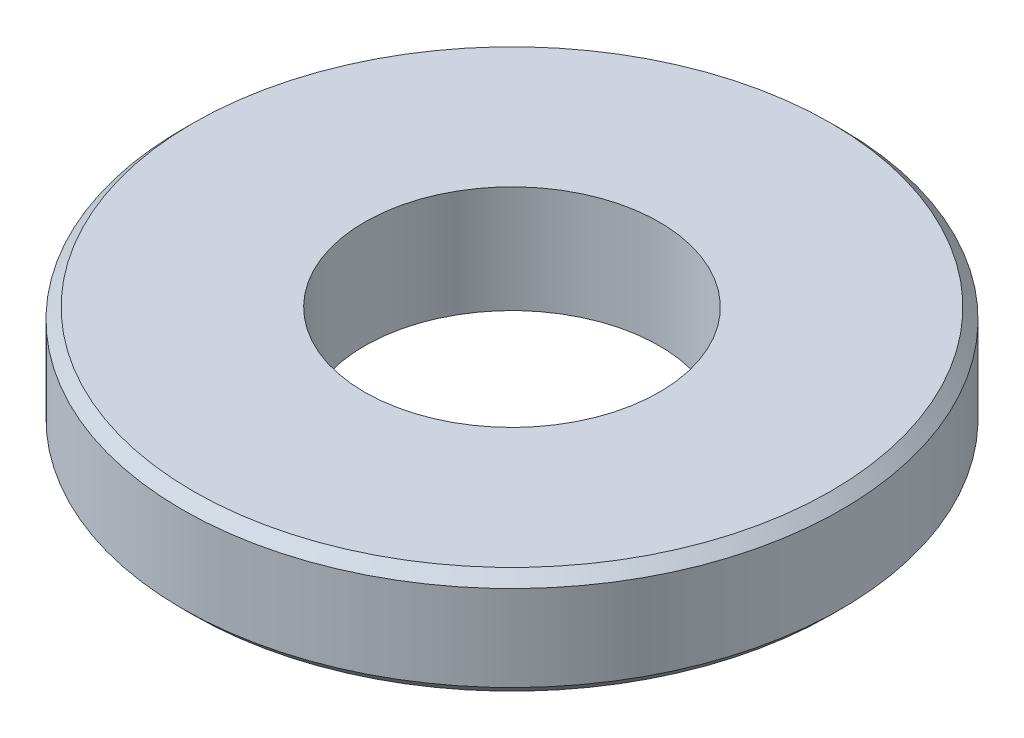
ISO-10303-21;
HEADER;
FILE_DESCRIPTION(('STEP AP214'),'2;1');
FILE_NAME('part.step','',(''),(''),'','','');
FILE_SCHEMA(('AUTOMOTIVE_DESIGN { 1 0 10303 214 1 1 1 1 }'));
ENDSEC;
DATA;
#1=APPLICATION_CONTEXT('core data for automotive mechanical design processes');
#2=APPLICATION_PROTOCOL_DEFINITION('international standard','automotive_design',2000,#1);
#3=PRODUCT_CONTEXT('',#1,'mechanical');
#4=PRODUCT('Part','Part','',(#3));
#5=PRODUCT_RELATED_PRODUCT_CATEGORY('part','',(#4));
#6=PRODUCT_DEFINITION_FORMATION('','',#4);
#7=PRODUCT_DEFINITION_CONTEXT('part definition',#1,'design');
#8=PRODUCT_DEFINITION('design','',#6,#7);
#9=PRODUCT_DEFINITION_SHAPE('','',#8);
#10=(LENGTH_UNIT() NAMED_UNIT(*) SI_UNIT(.MILLI.,.METRE.));
#11=(NAMED_UNIT(*) PLANE_ANGLE_UNIT() SI_UNIT($,.RADIAN.));
#12=(NAMED_UNIT(*) SI_UNIT($,.STERADIAN.) SOLID_ANGLE_UNIT());
#13=UNCERTAINTY_MEASURE_WITH_UNIT(LENGTH_MEASURE(1.E-05),#10,'distance_accuracy_value','');
#14=(GEOMETRIC_REPRESENTATION_CONTEXT(3) GLOBAL_UNCERTAINTY_ASSIGNED_CONTEXT((#13)) GLOBAL_UNIT_ASSIGNED_CONTEXT((#10,
#11,#12)) REPRESENTATION_CONTEXT('',''));
#15=CARTESIAN_POINT('',(0.,0.,0.));
#16=DIRECTION('',(0.,0.,1.));
#17=DIRECTION('',(1.,0.,0.));
#18=AXIS2_PLACEMENT_3D('',#15,#16,#17);
#19=CARTESIAN_POINT('',(0.,4.,0.));
#20=DIRECTION('',(0.,1.,0.));
#21=DIRECTION('',(0.,0.,1.));
#22=AXIS2_PLACEMENT_3D('',#19,#20,#21);
#23=PLANE('',#22);
#24=CARTESIAN_POINT('',(0.,4.,0.));
#25=DIRECTION('',(0.,1.,0.));
#26=DIRECTION('',(0.,0.,1.));
#27=AXIS2_PLACEMENT_3D('',#24,#25,#26);
#28=CIRCLE('',#27,11.9);
#29=CARTESIAN_POINT('',(0.,4.,11.9));
#30=VERTEX_POINT('',#29);
#31=EDGE_CURVE('E10',#30,#30,#28,.T.);
#32=ORIENTED_EDGE('',*,*,#31,.T.);
#33=EDGE_LOOP('',(#32));
#34=FACE_BOUND('',#33,.T.);
#35=CARTESIAN_POINT('',(0.,4.,0.));
#36=DIRECTION('',(0.,1.,0.));
#37=DIRECTION('',(0.,0.,1.));
#38=AXIS2_PLACEMENT_3D('',#35,#36,#37);
#39=CIRCLE('',#38,5.5);
#40=CARTESIAN_POINT('',(0.,4.,5.5));
#41=VERTEX_POINT('',#40);
#42=EDGE_CURVE('E51',#41,#41,#39,.T.);
#43=ORIENTED_EDGE('',*,*,#42,.F.);
#44=EDGE_LOOP('',(#43));
#45=FACE_BOUND('',#44,.T.);
#46=ADVANCED_FACE('F31',(#34,#45),#23,.T.);
#47=CARTESIAN_POINT('',(0.,0.,0.));
#48=DIRECTION('',(0.,1.,0.));
#49=DIRECTION('',(0.,0.,1.));
#50=AXIS2_PLACEMENT_3D('',#47,#48,#49);
#51=PLANE('',#50);
#52=CARTESIAN_POINT('',(0.,0.,0.));
#53=DIRECTION('',(0.,1.,0.));
#54=DIRECTION('',(0.,0.,1.));
#55=AXIS2_PLACEMENT_3D('',#52,#53,#54);
#56=CIRCLE('',#55,11.9);
#57=CARTESIAN_POINT('',(0.,0.,11.9));
#58=VERTEX_POINT('',#57);
#59=EDGE_CURVE('E38',#58,#58,#56,.F.);
#60=ORIENTED_EDGE('',*,*,#59,.T.);
#61=EDGE_LOOP('',(#60));
#62=FACE_BOUND('',#61,.T.);
#63=CARTESIAN_POINT('',(0.,0.,0.));
#64=DIRECTION('',(0.,1.,0.));
#65=DIRECTION('',(0.,0.,1.));
#66=AXIS2_PLACEMENT_3D('',#63,#64,#65);
#67=CIRCLE('',#66,5.5);
#68=CARTESIAN_POINT('',(0.,0.,5.5));
#69=VERTEX_POINT('',#68);
#70=EDGE_CURVE('E52',#69,#69,#67,.T.);
#71=ORIENTED_EDGE('',*,*,#70,.T.);
#72=EDGE_LOOP('',(#71));
#73=FACE_BOUND('',#72,.T.);
#74=ADVANCED_FACE('F62',(#62,#73),#51,.F.);
#75=CARTESIAN_POINT('',(0.,4.,0.));
#76=DIRECTION('',(0.,-1.,0.));
#77=DIRECTION('',(0.,0.,-1.));
#78=AXIS2_PLACEMENT_3D('',#75,#76,#77);
#79=CYLINDRICAL_SURFACE('',#78,12.3);
#80=CARTESIAN_POINT('',(0.,0.399999999999996,0.));
#81=DIRECTION('',(0.,1.,0.));
#82=DIRECTION('',(0.,0.,1.));
#83=AXIS2_PLACEMENT_3D('',#80,#81,#82);
#84=CIRCLE('',#83,12.3);
#85=CARTESIAN_POINT('',(0.,0.399999999999996,12.3));
#86=VERTEX_POINT('',#85);
#87=EDGE_CURVE('E42',#86,#86,#84,.T.);
#88=ORIENTED_EDGE('',*,*,#87,.T.);
#89=EDGE_LOOP('',(#88));
#90=FACE_BOUND('',#89,.T.);
#91=CARTESIAN_POINT('',(0.,3.6,0.));
#92=DIRECTION('',(0.,1.,0.));
#93=DIRECTION('',(0.,0.,1.));
#94=AXIS2_PLACEMENT_3D('',#91,#92,#93);
#95=CIRCLE('',#94,12.3);
#96=CARTESIAN_POINT('',(0.,3.6,12.3));
#97=VERTEX_POINT('',#96);
#98=EDGE_CURVE('E46',#97,#97,#95,.F.);
#99=ORIENTED_EDGE('',*,*,#98,.T.);
#100=EDGE_LOOP('',(#99));
#101=FACE_BOUND('',#100,.T.);
#102=ADVANCED_FACE('F67',(#90,#101),#79,.T.);
#103=CARTESIAN_POINT('',(0.,4.,0.));
#104=DIRECTION('',(0.,-1.,0.));
#105=DIRECTION('',(0.,0.,-1.));
#106=AXIS2_PLACEMENT_3D('',#103,#104,#105);
#107=CYLINDRICAL_SURFACE('',#106,5.5);
#108=ORIENTED_EDGE('',*,*,#42,.T.);
#109=EDGE_LOOP('',(#108));
#110=FACE_BOUND('',#109,.T.);
#111=ORIENTED_EDGE('',*,*,#70,.F.);
#112=EDGE_LOOP('',(#111));
#113=FACE_BOUND('',#112,.T.);
#114=ADVANCED_FACE('F58',(#110,#113),#107,.F.);
#115=CARTESIAN_POINT('',(0.,0.399999999999996,0.));
#116=DIRECTION('',(0.,1.,0.));
#117=DIRECTION('',(0.,0.,1.));
#118=AXIS2_PLACEMENT_3D('',#115,#116,#117);
#119=CONICAL_SURFACE('',#118,12.3,0.78539816339745);
#120=ORIENTED_EDGE('',*,*,#59,.F.);
#121=EDGE_LOOP('',(#120));
#122=FACE_BOUND('',#121,.T.);
#123=ORIENTED_EDGE('',*,*,#87,.F.);
#124=EDGE_LOOP('',(#123));
#125=FACE_BOUND('',#124,.T.);
#126=ADVANCED_FACE('F73',(#122,#125),#119,.T.);
#127=CARTESIAN_POINT('',(0.,4.,0.));
#128=DIRECTION('',(0.,-1.,0.));
#129=DIRECTION('',(0.,0.,-1.));
#130=AXIS2_PLACEMENT_3D('',#127,#128,#129);
#131=CONICAL_SURFACE('',#130,11.9,0.785398163397442);
#132=ORIENTED_EDGE('',*,*,#98,.F.);
#133=EDGE_LOOP('',(#132));
#134=FACE_BOUND('',#133,.T.);
#135=ORIENTED_EDGE('',*,*,#31,.F.);
#136=EDGE_LOOP('',(#135));
#137=FACE_BOUND('',#136,.T.);
#138=ADVANCED_FACE('F33',(#134,#137),#131,.T.);
#139=CLOSED_SHELL('',(#46,#74,#102,#114,#126,#138));
#140=MANIFOLD_SOLID_BREP('B2',#139);
#141=ADVANCED_BREP_SHAPE_REPRESENTATION('',(#18,#140),#14);
#142=SHAPE_DEFINITION_REPRESENTATION(#9,#141);
ENDSEC;
END-ISO-10303-21;
